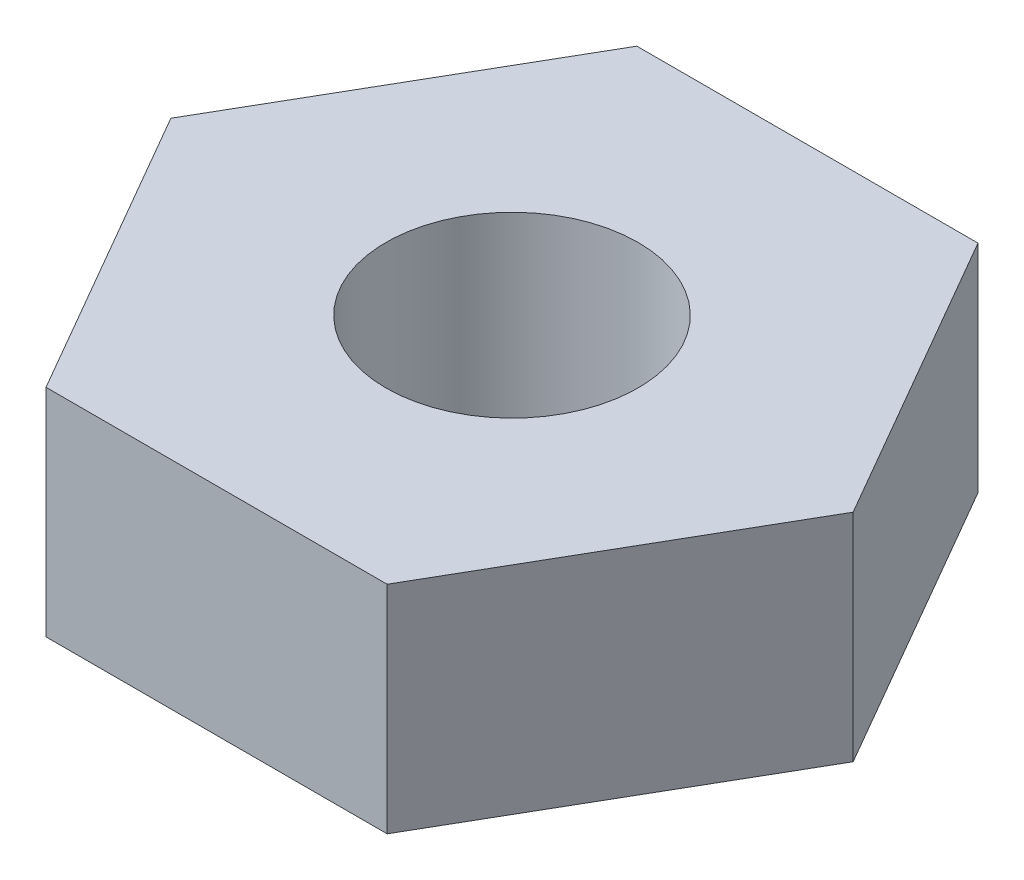
ISO-10303-21;
HEADER;
FILE_DESCRIPTION(('STEP AP214'),'2;1');
FILE_NAME('part.step','',(''),(''),'','','');
FILE_SCHEMA(('AUTOMOTIVE_DESIGN { 1 0 10303 214 1 1 1 1 }'));
ENDSEC;
DATA;
#1=APPLICATION_CONTEXT('core data for automotive mechanical design processes');
#2=APPLICATION_PROTOCOL_DEFINITION('international standard','automotive_design',2000,#1);
#3=PRODUCT_CONTEXT('',#1,'mechanical');
#4=PRODUCT('Part','Part','',(#3));
#5=PRODUCT_RELATED_PRODUCT_CATEGORY('part','',(#4));
#6=PRODUCT_DEFINITION_FORMATION('','',#4);
#7=PRODUCT_DEFINITION_CONTEXT('part definition',#1,'design');
#8=PRODUCT_DEFINITION('design','',#6,#7);
#9=PRODUCT_DEFINITION_SHAPE('','',#8);
#10=(LENGTH_UNIT() NAMED_UNIT(*) SI_UNIT(.MILLI.,.METRE.));
#11=(NAMED_UNIT(*) PLANE_ANGLE_UNIT() SI_UNIT($,.RADIAN.));
#12=(NAMED_UNIT(*) SI_UNIT($,.STERADIAN.) SOLID_ANGLE_UNIT());
#13=UNCERTAINTY_MEASURE_WITH_UNIT(LENGTH_MEASURE(1.E-05),#10,'distance_accuracy_value','');
#14=(GEOMETRIC_REPRESENTATION_CONTEXT(3) GLOBAL_UNCERTAINTY_ASSIGNED_CONTEXT((#13)) GLOBAL_UNIT_ASSIGNED_CONTEXT((#10,
#11,#12)) REPRESENTATION_CONTEXT('',''));
#15=CARTESIAN_POINT('',(0.,0.,0.));
#16=DIRECTION('',(0.,0.,1.));
#17=DIRECTION('',(1.,0.,0.));
#18=AXIS2_PLACEMENT_3D('',#15,#16,#17);
#19=CARTESIAN_POINT('',(0.,3.,0.));
#20=DIRECTION('',(0.,1.,0.));
#21=DIRECTION('',(0.,0.,1.));
#22=AXIS2_PLACEMENT_3D('',#19,#20,#21);
#23=PLANE('',#22);
#24=DIRECTION('',(0.5,0.,-0.866025403784439));
#25=VECTOR('',#24,1.);
#26=CARTESIAN_POINT('',(2.36713610367747,3.,4.1));
#27=LINE('',#26,#25);
#28=CARTESIAN_POINT('',(2.36713610367747,3.,4.1));
#29=VERTEX_POINT('',#28);
#30=CARTESIAN_POINT('',(4.73427220735493,3.,0.));
#31=VERTEX_POINT('',#30);
#32=EDGE_CURVE('E146',#29,#31,#27,.T.);
#33=ORIENTED_EDGE('',*,*,#32,.T.);
#34=DIRECTION('',(-0.5,0.,-0.866025403784439));
#35=VECTOR('',#34,1.);
#36=CARTESIAN_POINT('',(4.73427220735493,3.,0.));
#37=LINE('',#36,#35);
#38=CARTESIAN_POINT('',(2.36713610367746,3.,-4.1));
#39=VERTEX_POINT('',#38);
#40=EDGE_CURVE('E94',#31,#39,#37,.T.);
#41=ORIENTED_EDGE('',*,*,#40,.T.);
#42=DIRECTION('',(-1.,0.,0.));
#43=VECTOR('',#42,1.);
#44=CARTESIAN_POINT('',(2.36713610367746,3.,-4.1));
#45=LINE('',#44,#43);
#46=CARTESIAN_POINT('',(-2.36713610367747,3.,-4.1));
#47=VERTEX_POINT('',#46);
#48=EDGE_CURVE('E107',#39,#47,#45,.T.);
#49=ORIENTED_EDGE('',*,*,#48,.T.);
#50=DIRECTION('',(-0.5,0.,0.866025403784439));
#51=VECTOR('',#50,1.);
#52=CARTESIAN_POINT('',(-2.36713610367747,3.,-4.1));
#53=LINE('',#52,#51);
#54=CARTESIAN_POINT('',(-4.73427220735493,3.,0.));
#55=VERTEX_POINT('',#54);
#56=EDGE_CURVE('E101',#47,#55,#53,.T.);
#57=ORIENTED_EDGE('',*,*,#56,.T.);
#58=DIRECTION('',(0.5,0.,0.866025403784439));
#59=VECTOR('',#58,1.);
#60=CARTESIAN_POINT('',(-4.73427220735493,3.,0.));
#61=LINE('',#60,#59);
#62=CARTESIAN_POINT('',(-2.36713610367747,3.,4.1));
#63=VERTEX_POINT('',#62);
#64=EDGE_CURVE('E105',#55,#63,#61,.T.);
#65=ORIENTED_EDGE('',*,*,#64,.T.);
#66=DIRECTION('',(1.,0.,0.));
#67=VECTOR('',#66,1.);
#68=CARTESIAN_POINT('',(-2.36713610367747,3.,4.1));
#69=LINE('',#68,#67);
#70=EDGE_CURVE('E57',#63,#29,#69,.T.);
#71=ORIENTED_EDGE('',*,*,#70,.T.);
#72=EDGE_LOOP('',(#33,#41,#49,#57,#65,#71));
#73=FACE_BOUND('',#72,.T.);
#74=CARTESIAN_POINT('',(0.,3.,0.));
#75=DIRECTION('',(0.,1.,0.));
#76=DIRECTION('',(0.,0.,1.));
#77=AXIS2_PLACEMENT_3D('',#74,#75,#76);
#78=CIRCLE('',#77,1.75);
#79=CARTESIAN_POINT('',(0.,3.,1.75));
#80=VERTEX_POINT('',#79);
#81=EDGE_CURVE('E134',#80,#80,#78,.T.);
#82=ORIENTED_EDGE('',*,*,#81,.F.);
#83=EDGE_LOOP('',(#82));
#84=FACE_BOUND('',#83,.T.);
#85=ADVANCED_FACE('F39',(#73,#84),#23,.T.);
#86=CARTESIAN_POINT('',(0.,0.,0.));
#87=DIRECTION('',(0.,1.,0.));
#88=DIRECTION('',(0.,0.,1.));
#89=AXIS2_PLACEMENT_3D('',#86,#87,#88);
#90=PLANE('',#89);
#91=DIRECTION('',(0.5,0.,-0.866025403784439));
#92=VECTOR('',#91,1.);
#93=CARTESIAN_POINT('',(2.36713610367747,0.,4.1));
#94=LINE('',#93,#92);
#95=CARTESIAN_POINT('',(2.36713610367747,0.,4.1));
#96=VERTEX_POINT('',#95);
#97=CARTESIAN_POINT('',(4.73427220735493,0.,0.));
#98=VERTEX_POINT('',#97);
#99=EDGE_CURVE('E129',#96,#98,#94,.T.);
#100=ORIENTED_EDGE('',*,*,#99,.F.);
#101=DIRECTION('',(1.,0.,0.));
#102=VECTOR('',#101,1.);
#103=CARTESIAN_POINT('',(-2.36713610367747,0.,4.1));
#104=LINE('',#103,#102);
#105=CARTESIAN_POINT('',(-2.36713610367747,0.,4.1));
#106=VERTEX_POINT('',#105);
#107=EDGE_CURVE('E86',#106,#96,#104,.T.);
#108=ORIENTED_EDGE('',*,*,#107,.F.);
#109=DIRECTION('',(0.5,0.,0.866025403784439));
#110=VECTOR('',#109,1.);
#111=CARTESIAN_POINT('',(-4.73427220735493,0.,0.));
#112=LINE('',#111,#110);
#113=CARTESIAN_POINT('',(-4.73427220735493,0.,0.));
#114=VERTEX_POINT('',#113);
#115=EDGE_CURVE('E80',#114,#106,#112,.T.);
#116=ORIENTED_EDGE('',*,*,#115,.F.);
#117=DIRECTION('',(-0.5,0.,0.866025403784439));
#118=VECTOR('',#117,1.);
#119=CARTESIAN_POINT('',(-2.36713610367747,0.,-4.1));
#120=LINE('',#119,#118);
#121=CARTESIAN_POINT('',(-2.36713610367747,0.,-4.1));
#122=VERTEX_POINT('',#121);
#123=EDGE_CURVE('E116',#122,#114,#120,.T.);
#124=ORIENTED_EDGE('',*,*,#123,.F.);
#125=DIRECTION('',(-1.,0.,0.));
#126=VECTOR('',#125,1.);
#127=CARTESIAN_POINT('',(2.36713610367746,0.,-4.1));
#128=LINE('',#127,#126);
#129=CARTESIAN_POINT('',(2.36713610367746,0.,-4.1));
#130=VERTEX_POINT('',#129);
#131=EDGE_CURVE('E137',#130,#122,#128,.T.);
#132=ORIENTED_EDGE('',*,*,#131,.F.);
#133=DIRECTION('',(-0.5,0.,-0.866025403784439));
#134=VECTOR('',#133,1.);
#135=CARTESIAN_POINT('',(4.73427220735493,0.,0.));
#136=LINE('',#135,#134);
#137=EDGE_CURVE('E133',#98,#130,#136,.T.);
#138=ORIENTED_EDGE('',*,*,#137,.F.);
#139=EDGE_LOOP('',(#100,#108,#116,#124,#132,#138));
#140=FACE_BOUND('',#139,.T.);
#141=CARTESIAN_POINT('',(0.,0.,0.));
#142=DIRECTION('',(0.,1.,0.));
#143=DIRECTION('',(0.,0.,1.));
#144=AXIS2_PLACEMENT_3D('',#141,#142,#143);
#145=CIRCLE('',#144,1.75);
#146=CARTESIAN_POINT('',(0.,0.,1.75));
#147=VERTEX_POINT('',#146);
#148=EDGE_CURVE('E243',#147,#147,#145,.T.);
#149=ORIENTED_EDGE('',*,*,#148,.T.);
#150=EDGE_LOOP('',(#149));
#151=FACE_BOUND('',#150,.T.);
#152=ADVANCED_FACE('F159',(#140,#151),#90,.F.);
#153=CARTESIAN_POINT('',(2.36713610367747,3.,4.1));
#154=DIRECTION('',(-0.866025403784439,0.,-0.5));
#155=DIRECTION('',(-0.5,0.,0.866025403784439));
#156=AXIS2_PLACEMENT_3D('',#153,#154,#155);
#157=PLANE('',#156);
#158=ORIENTED_EDGE('',*,*,#99,.T.);
#159=DIRECTION('',(0.,-1.,0.));
#160=VECTOR('',#159,1.);
#161=CARTESIAN_POINT('',(4.73427220735493,3.,0.));
#162=LINE('',#161,#160);
#163=EDGE_CURVE('E11',#31,#98,#162,.T.);
#164=ORIENTED_EDGE('',*,*,#163,.F.);
#165=ORIENTED_EDGE('',*,*,#32,.F.);
#166=DIRECTION('',(0.,-1.,0.));
#167=VECTOR('',#166,1.);
#168=CARTESIAN_POINT('',(2.36713610367747,3.,4.1));
#169=LINE('',#168,#167);
#170=EDGE_CURVE('E125',#29,#96,#169,.T.);
#171=ORIENTED_EDGE('',*,*,#170,.T.);
#172=EDGE_LOOP('',(#158,#164,#165,#171));
#173=FACE_BOUND('',#172,.T.);
#174=ADVANCED_FACE('F41',(#173),#157,.F.);
#175=CARTESIAN_POINT('',(4.73427220735493,3.,0.));
#176=DIRECTION('',(-0.866025403784439,0.,0.5));
#177=DIRECTION('',(0.5,0.,0.866025403784439));
#178=AXIS2_PLACEMENT_3D('',#175,#176,#177);
#179=PLANE('',#178);
#180=ORIENTED_EDGE('',*,*,#137,.T.);
#181=DIRECTION('',(0.,-1.,0.));
#182=VECTOR('',#181,1.);
#183=CARTESIAN_POINT('',(2.36713610367746,3.,-4.1));
#184=LINE('',#183,#182);
#185=EDGE_CURVE('E49',#39,#130,#184,.T.);
#186=ORIENTED_EDGE('',*,*,#185,.F.);
#187=ORIENTED_EDGE('',*,*,#40,.F.);
#188=ORIENTED_EDGE('',*,*,#163,.T.);
#189=EDGE_LOOP('',(#180,#186,#187,#188));
#190=FACE_BOUND('',#189,.T.);
#191=ADVANCED_FACE('F184',(#190),#179,.F.);
#192=CARTESIAN_POINT('',(2.36713610367746,3.,-4.1));
#193=DIRECTION('',(0.,0.,1.));
#194=DIRECTION('',(1.,0.,0.));
#195=AXIS2_PLACEMENT_3D('',#192,#193,#194);
#196=PLANE('',#195);
#197=ORIENTED_EDGE('',*,*,#131,.T.);
#198=DIRECTION('',(0.,-1.,0.));
#199=VECTOR('',#198,1.);
#200=CARTESIAN_POINT('',(-2.36713610367747,3.,-4.1));
#201=LINE('',#200,#199);
#202=EDGE_CURVE('E118',#47,#122,#201,.T.);
#203=ORIENTED_EDGE('',*,*,#202,.F.);
#204=ORIENTED_EDGE('',*,*,#48,.F.);
#205=ORIENTED_EDGE('',*,*,#185,.T.);
#206=EDGE_LOOP('',(#197,#203,#204,#205));
#207=FACE_BOUND('',#206,.T.);
#208=ADVANCED_FACE('F156',(#207),#196,.F.);
#209=CARTESIAN_POINT('',(-2.36713610367747,3.,-4.1));
#210=DIRECTION('',(0.866025403784439,0.,0.5));
#211=DIRECTION('',(0.5,0.,-0.866025403784439));
#212=AXIS2_PLACEMENT_3D('',#209,#210,#211);
#213=PLANE('',#212);
#214=ORIENTED_EDGE('',*,*,#123,.T.);
#215=DIRECTION('',(0.,-1.,0.));
#216=VECTOR('',#215,1.);
#217=CARTESIAN_POINT('',(-4.73427220735493,3.,0.));
#218=LINE('',#217,#216);
#219=EDGE_CURVE('E113',#55,#114,#218,.T.);
#220=ORIENTED_EDGE('',*,*,#219,.F.);
#221=ORIENTED_EDGE('',*,*,#56,.F.);
#222=ORIENTED_EDGE('',*,*,#202,.T.);
#223=EDGE_LOOP('',(#214,#220,#221,#222));
#224=FACE_BOUND('',#223,.T.);
#225=ADVANCED_FACE('F114',(#224),#213,.F.);
#226=CARTESIAN_POINT('',(-4.73427220735493,3.,0.));
#227=DIRECTION('',(0.866025403784439,0.,-0.5));
#228=DIRECTION('',(-0.5,0.,-0.866025403784439));
#229=AXIS2_PLACEMENT_3D('',#226,#227,#228);
#230=PLANE('',#229);
#231=ORIENTED_EDGE('',*,*,#115,.T.);
#232=DIRECTION('',(0.,-1.,0.));
#233=VECTOR('',#232,1.);
#234=CARTESIAN_POINT('',(-2.36713610367747,3.,4.1));
#235=LINE('',#234,#233);
#236=EDGE_CURVE('E119',#63,#106,#235,.T.);
#237=ORIENTED_EDGE('',*,*,#236,.F.);
#238=ORIENTED_EDGE('',*,*,#64,.F.);
#239=ORIENTED_EDGE('',*,*,#219,.T.);
#240=EDGE_LOOP('',(#231,#237,#238,#239));
#241=FACE_BOUND('',#240,.T.);
#242=ADVANCED_FACE('F121',(#241),#230,.F.);
#243=CARTESIAN_POINT('',(-2.36713610367747,3.,4.1));
#244=DIRECTION('',(0.,0.,-1.));
#245=DIRECTION('',(-1.,0.,0.));
#246=AXIS2_PLACEMENT_3D('',#243,#244,#245);
#247=PLANE('',#246);
#248=ORIENTED_EDGE('',*,*,#107,.T.);
#249=ORIENTED_EDGE('',*,*,#170,.F.);
#250=ORIENTED_EDGE('',*,*,#70,.F.);
#251=ORIENTED_EDGE('',*,*,#236,.T.);
#252=EDGE_LOOP('',(#248,#249,#250,#251));
#253=FACE_BOUND('',#252,.T.);
#254=ADVANCED_FACE('F164',(#253),#247,.F.);
#255=CARTESIAN_POINT('',(0.,3.,0.));
#256=DIRECTION('',(0.,-1.,0.));
#257=DIRECTION('',(0.,0.,-1.));
#258=AXIS2_PLACEMENT_3D('',#255,#256,#257);
#259=CYLINDRICAL_SURFACE('',#258,1.75);
#260=ORIENTED_EDGE('',*,*,#81,.T.);
#261=EDGE_LOOP('',(#260));
#262=FACE_BOUND('',#261,.T.);
#263=ORIENTED_EDGE('',*,*,#148,.F.);
#264=EDGE_LOOP('',(#263));
#265=FACE_BOUND('',#264,.T.);
#266=ADVANCED_FACE('F166',(#262,#265),#259,.F.);
#267=CLOSED_SHELL('',(#85,#152,#174,#191,#208,#225,#242,#254,#266));
#268=MANIFOLD_SOLID_BREP('B2',#267);
#269=ADVANCED_BREP_SHAPE_REPRESENTATION('',(#18,#268),#14);
#270=SHAPE_DEFINITION_REPRESENTATION(#9,#269);
ENDSEC;
END-ISO-10303-21;
